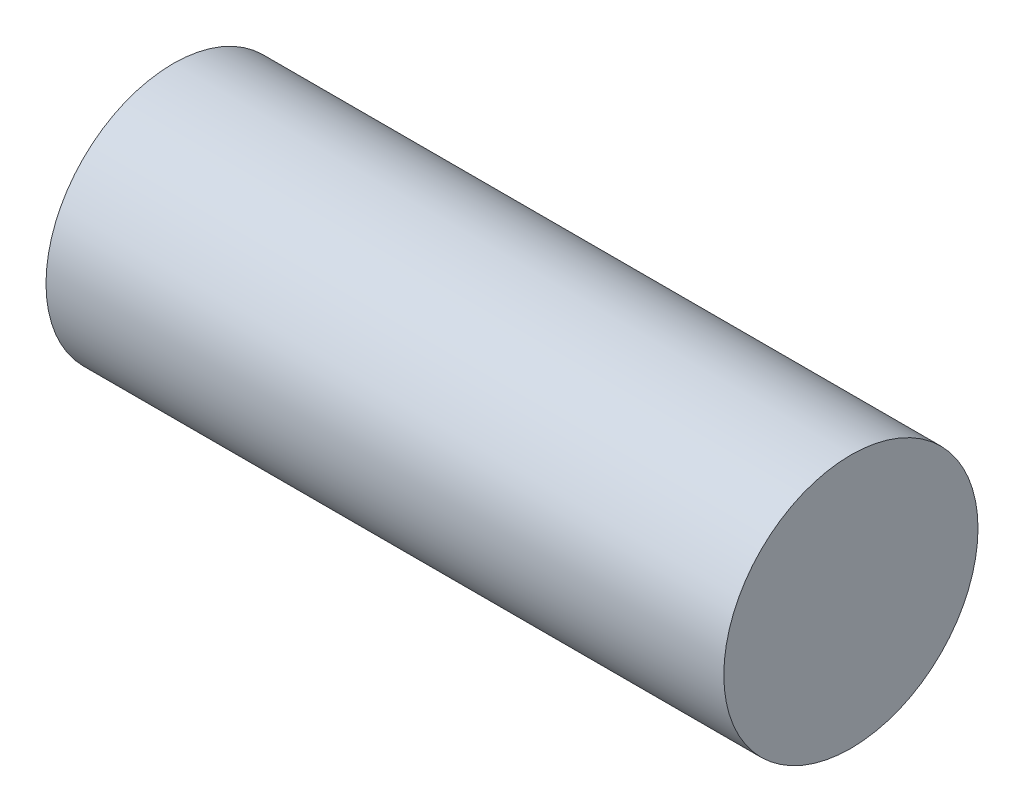
ISO-10303-21;
HEADER;
FILE_DESCRIPTION(('STEP AP214'),'2;1');
FILE_NAME('part.step','',(''),(''),'','','');
FILE_SCHEMA(('AUTOMOTIVE_DESIGN { 1 0 10303 214 1 1 1 1 }'));
ENDSEC;
DATA;
#1=APPLICATION_CONTEXT('core data for automotive mechanical design processes');
#2=APPLICATION_PROTOCOL_DEFINITION('international standard','automotive_design',2000,#1);
#3=PRODUCT_CONTEXT('',#1,'mechanical');
#4=PRODUCT('Part','Part','',(#3));
#5=PRODUCT_RELATED_PRODUCT_CATEGORY('part','',(#4));
#6=PRODUCT_DEFINITION_FORMATION('','',#4);
#7=PRODUCT_DEFINITION_CONTEXT('part definition',#1,'design');
#8=PRODUCT_DEFINITION('design','',#6,#7);
#9=PRODUCT_DEFINITION_SHAPE('','',#8);
#10=(LENGTH_UNIT() NAMED_UNIT(*) SI_UNIT(.MILLI.,.METRE.));
#11=(NAMED_UNIT(*) PLANE_ANGLE_UNIT() SI_UNIT($,.RADIAN.));
#12=(NAMED_UNIT(*) SI_UNIT($,.STERADIAN.) SOLID_ANGLE_UNIT());
#13=UNCERTAINTY_MEASURE_WITH_UNIT(LENGTH_MEASURE(1.E-05),#10,'distance_accuracy_value','');
#14=(GEOMETRIC_REPRESENTATION_CONTEXT(3) GLOBAL_UNCERTAINTY_ASSIGNED_CONTEXT((#13)) GLOBAL_UNIT_ASSIGNED_CONTEXT((#10,
#11,#12)) REPRESENTATION_CONTEXT('',''));
#15=CARTESIAN_POINT('',(0.,0.,0.));
#16=DIRECTION('',(0.,0.,1.));
#17=DIRECTION('',(1.,0.,0.));
#18=AXIS2_PLACEMENT_3D('',#15,#16,#17);
#19=CARTESIAN_POINT('',(16.,0.,0.));
#20=DIRECTION('',(-1.,0.,0.));
#21=DIRECTION('',(0.,0.,1.));
#22=AXIS2_PLACEMENT_3D('',#19,#20,#21);
#23=CYLINDRICAL_SURFACE('',#22,3.);
#24=CARTESIAN_POINT('',(16.,0.,0.));
#25=DIRECTION('',(1.,0.,0.));
#26=DIRECTION('',(0.,0.,-1.));
#27=AXIS2_PLACEMENT_3D('',#24,#25,#26);
#28=CIRCLE('',#27,3.);
#29=CARTESIAN_POINT('',(16.,0.,-3.));
#30=VERTEX_POINT('',#29);
#31=EDGE_CURVE('E10',#30,#30,#28,.T.);
#32=ORIENTED_EDGE('',*,*,#31,.F.);
#33=EDGE_LOOP('',(#32));
#34=FACE_BOUND('',#33,.T.);
#35=CARTESIAN_POINT('',(0.,0.,0.));
#36=DIRECTION('',(1.,0.,0.));
#37=DIRECTION('',(0.,0.,-1.));
#38=AXIS2_PLACEMENT_3D('',#35,#36,#37);
#39=CIRCLE('',#38,3.);
#40=CARTESIAN_POINT('',(0.,0.,-3.));
#41=VERTEX_POINT('',#40);
#42=EDGE_CURVE('E40',#41,#41,#39,.T.);
#43=ORIENTED_EDGE('',*,*,#42,.T.);
#44=EDGE_LOOP('',(#43));
#45=FACE_BOUND('',#44,.T.);
#46=ADVANCED_FACE('F37',(#34,#45),#23,.T.);
#47=CARTESIAN_POINT('',(16.,0.,0.));
#48=DIRECTION('',(1.,0.,0.));
#49=DIRECTION('',(0.,0.,-1.));
#50=AXIS2_PLACEMENT_3D('',#47,#48,#49);
#51=PLANE('',#50);
#52=ORIENTED_EDGE('',*,*,#31,.T.);
#53=EDGE_LOOP('',(#52));
#54=FACE_BOUND('',#53,.T.);
#55=ADVANCED_FACE('F54',(#54),#51,.T.);
#56=CARTESIAN_POINT('',(0.,0.,0.));
#57=DIRECTION('',(1.,0.,0.));
#58=DIRECTION('',(0.,0.,-1.));
#59=AXIS2_PLACEMENT_3D('',#56,#57,#58);
#60=PLANE('',#59);
#61=ORIENTED_EDGE('',*,*,#42,.F.);
#62=EDGE_LOOP('',(#61));
#63=FACE_BOUND('',#62,.T.);
#64=ADVANCED_FACE('F52',(#63),#60,.F.);
#65=CLOSED_SHELL('',(#46,#55,#64));
#66=MANIFOLD_SOLID_BREP('B2',#65);
#67=ADVANCED_BREP_SHAPE_REPRESENTATION('',(#18,#66),#14);
#68=SHAPE_DEFINITION_REPRESENTATION(#9,#67);
ENDSEC;
END-ISO-10303-21;
